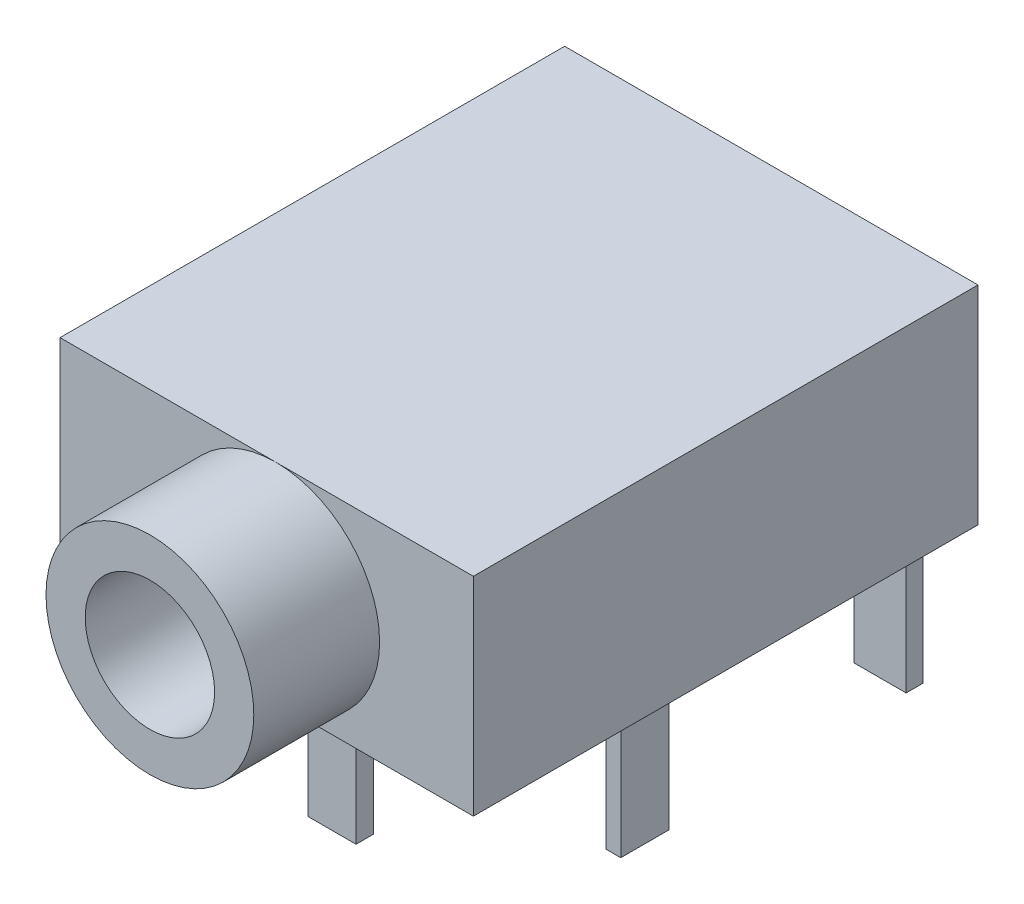
ISO-10303-21;
HEADER;
FILE_DESCRIPTION(('STEP AP214'),'2;1');
FILE_NAME('part.step','',(''),(''),'','','');
FILE_SCHEMA(('AUTOMOTIVE_DESIGN { 1 0 10303 214 1 1 1 1 }'));
ENDSEC;
DATA;
#1=APPLICATION_CONTEXT('core data for automotive mechanical design processes');
#2=APPLICATION_PROTOCOL_DEFINITION('international standard','automotive_design',2000,#1);
#3=PRODUCT_CONTEXT('',#1,'mechanical');
#4=PRODUCT('Part','Part','',(#3));
#5=PRODUCT_RELATED_PRODUCT_CATEGORY('part','',(#4));
#6=PRODUCT_DEFINITION_FORMATION('','',#4);
#7=PRODUCT_DEFINITION_CONTEXT('part definition',#1,'design');
#8=PRODUCT_DEFINITION('design','',#6,#7);
#9=PRODUCT_DEFINITION_SHAPE('','',#8);
#10=(LENGTH_UNIT() NAMED_UNIT(*) SI_UNIT(.MILLI.,.METRE.));
#11=(NAMED_UNIT(*) PLANE_ANGLE_UNIT() SI_UNIT($,.RADIAN.));
#12=(NAMED_UNIT(*) SI_UNIT($,.STERADIAN.) SOLID_ANGLE_UNIT());
#13=UNCERTAINTY_MEASURE_WITH_UNIT(LENGTH_MEASURE(1.E-05),#10,'distance_accuracy_value','');
#14=(GEOMETRIC_REPRESENTATION_CONTEXT(3) GLOBAL_UNCERTAINTY_ASSIGNED_CONTEXT((#13)) GLOBAL_UNIT_ASSIGNED_CONTEXT((#10,
#11,#12)) REPRESENTATION_CONTEXT('',''));
#15=CARTESIAN_POINT('',(0.,0.,0.));
#16=DIRECTION('',(0.,0.,1.));
#17=DIRECTION('',(1.,0.,0.));
#18=AXIS2_PLACEMENT_3D('',#15,#16,#17);
#19=CARTESIAN_POINT('',(5.75,-0.00598738400779501,-0.0115893273797702));
#20=DIRECTION('',(0.,1.,0.));
#21=DIRECTION('',(0.,0.,1.));
#22=AXIS2_PLACEMENT_3D('',#19,#20,#21);
#23=PLANE('',#22);
#24=DIRECTION('',(-1.,0.,0.));
#25=VECTOR('',#24,1.);
#26=CARTESIAN_POINT('',(4.80049461253483,-0.00598738400779501,-5.06124471957516));
#27=LINE('',#26,#25);
#28=CARTESIAN_POINT('',(4.80049461253483,-0.00598738400779501,-5.06124471957516));
#29=VERTEX_POINT('',#28);
#30=CARTESIAN_POINT('',(4.38361750312257,-0.00598738400779501,-5.06124471957516));
#31=VERTEX_POINT('',#30);
#32=EDGE_CURVE('E225',#29,#31,#27,.T.);
#33=ORIENTED_EDGE('',*,*,#32,.F.);
#34=DIRECTION('',(0.,0.,1.));
#35=VECTOR('',#34,1.);
#36=CARTESIAN_POINT('',(4.80049461253483,-0.00598738400779501,-5.06124471957516));
#37=LINE('',#36,#35);
#38=CARTESIAN_POINT('',(4.80049461253483,-0.00598738400779501,-6.40451540545913));
#39=VERTEX_POINT('',#38);
#40=EDGE_CURVE('E238',#39,#29,#37,.T.);
#41=ORIENTED_EDGE('',*,*,#40,.F.);
#42=DIRECTION('',(1.,0.,0.));
#43=VECTOR('',#42,1.);
#44=CARTESIAN_POINT('',(4.80049461253483,-0.00598738400779501,-6.40451540545913));
#45=LINE('',#44,#43);
#46=CARTESIAN_POINT('',(4.38361750312257,-0.00598738400779501,-6.40451540545913));
#47=VERTEX_POINT('',#46);
#48=EDGE_CURVE('E247',#47,#39,#45,.T.);
#49=ORIENTED_EDGE('',*,*,#48,.F.);
#50=DIRECTION('',(0.,0.,-1.));
#51=VECTOR('',#50,1.);
#52=CARTESIAN_POINT('',(4.38361750312257,-0.00598738400779501,-5.06124471957516));
#53=LINE('',#52,#51);
#54=EDGE_CURVE('E228',#31,#47,#53,.T.);
#55=ORIENTED_EDGE('',*,*,#54,.F.);
#56=EDGE_LOOP('',(#33,#41,#49,#55));
#57=FACE_BOUND('',#56,.T.);
#58=DIRECTION('',(-1.,0.,0.));
#59=VECTOR('',#58,1.);
#60=CARTESIAN_POINT('',(-4.62556002806475,-0.00598738400779501,-9.2994953319332));
#61=LINE('',#60,#59);
#62=CARTESIAN_POINT('',(-4.62556002806475,-0.00598738400779501,-9.2994953319332));
#63=VERTEX_POINT('',#62);
#64=CARTESIAN_POINT('',(-5.06559697688881,-0.00598738400779501,-9.2994953319332));
#65=VERTEX_POINT('',#64);
#66=EDGE_CURVE('E296',#63,#65,#61,.T.);
#67=ORIENTED_EDGE('',*,*,#66,.F.);
#68=DIRECTION('',(0.,0.,1.));
#69=VECTOR('',#68,1.);
#70=CARTESIAN_POINT('',(-4.62556002806475,-0.00598738400779501,-9.2994953319332));
#71=LINE('',#70,#69);
#72=CARTESIAN_POINT('',(-4.62556002806475,-0.00598738400779501,-10.7122455360525));
#73=VERTEX_POINT('',#72);
#74=EDGE_CURVE('E301',#73,#63,#71,.T.);
#75=ORIENTED_EDGE('',*,*,#74,.F.);
#76=DIRECTION('',(1.,0.,0.));
#77=VECTOR('',#76,1.);
#78=CARTESIAN_POINT('',(-4.62556002806475,-0.00598738400779501,-10.7122455360525));
#79=LINE('',#78,#77);
#80=CARTESIAN_POINT('',(-5.06559697688881,-0.00598738400779501,-10.7122455360525));
#81=VERTEX_POINT('',#80);
#82=EDGE_CURVE('E313',#81,#73,#79,.T.);
#83=ORIENTED_EDGE('',*,*,#82,.F.);
#84=DIRECTION('',(0.,0.,-1.));
#85=VECTOR('',#84,1.);
#86=CARTESIAN_POINT('',(-5.06559697688881,-0.00598738400779501,-9.2994953319332));
#87=LINE('',#86,#85);
#88=EDGE_CURVE('E310',#65,#81,#87,.T.);
#89=ORIENTED_EDGE('',*,*,#88,.F.);
#90=EDGE_LOOP('',(#67,#75,#83,#89));
#91=FACE_BOUND('',#90,.T.);
#92=DIRECTION('',(0.,0.,-1.));
#93=VECTOR('',#92,1.);
#94=CARTESIAN_POINT('',(-5.75,-0.00598738400779501,-0.0115893273797702));
#95=LINE('',#94,#93);
#96=CARTESIAN_POINT('',(-5.75,-0.00598738400779501,-0.0115893273797702));
#97=VERTEX_POINT('',#96);
#98=CARTESIAN_POINT('',(-5.75,-0.00598738400779501,-14.0506281407972));
#99=VERTEX_POINT('',#98);
#100=EDGE_CURVE('E389',#97,#99,#95,.T.);
#101=ORIENTED_EDGE('',*,*,#100,.T.);
#102=DIRECTION('',(-1.,0.,0.));
#103=VECTOR('',#102,1.);
#104=CARTESIAN_POINT('',(5.75,-0.00598738400779501,-14.0506281407972));
#105=LINE('',#104,#103);
#106=CARTESIAN_POINT('',(5.75,-0.00598738400779501,-14.0506281407972));
#107=VERTEX_POINT('',#106);
#108=EDGE_CURVE('E394',#107,#99,#105,.T.);
#109=ORIENTED_EDGE('',*,*,#108,.F.);
#110=DIRECTION('',(0.,0.,-1.));
#111=VECTOR('',#110,1.);
#112=CARTESIAN_POINT('',(5.75,-0.00598738400779501,-0.0115893273797702));
#113=LINE('',#112,#111);
#114=CARTESIAN_POINT('',(5.75,-0.00598738400779501,-0.0115893273797702));
#115=VERTEX_POINT('',#114);
#116=EDGE_CURVE('E379',#115,#107,#113,.T.);
#117=ORIENTED_EDGE('',*,*,#116,.F.);
#118=DIRECTION('',(-1.,0.,0.));
#119=VECTOR('',#118,1.);
#120=CARTESIAN_POINT('',(5.75,-0.00598738400779501,-0.0115893273797702));
#121=LINE('',#120,#119);
#122=CARTESIAN_POINT('',(0.25,-0.00598738400779501,-0.0115893273797702));
#123=VERTEX_POINT('',#122);
#124=EDGE_CURVE('E397',#115,#123,#121,.T.);
#125=ORIENTED_EDGE('',*,*,#124,.T.);
#126=EDGE_CURVE('E396',#123,#97,#121,.T.);
#127=ORIENTED_EDGE('',*,*,#126,.T.);
#128=EDGE_LOOP('',(#101,#109,#117,#125,#127));
#129=FACE_BOUND('',#128,.T.);
#130=DIRECTION('',(0.,0.,1.));
#131=VECTOR('',#130,1.);
#132=CARTESIAN_POINT('',(4.80049461253483,-0.00598738400779501,-13.0001475178515));
#133=LINE('',#132,#131);
#134=CARTESIAN_POINT('',(4.80049461253483,-0.00598738400779501,-13.4692953083365));
#135=VERTEX_POINT('',#134);
#136=CARTESIAN_POINT('',(4.80049461253483,-0.00598738400779501,-13.0001475178515));
#137=VERTEX_POINT('',#136);
#138=EDGE_CURVE('E329',#135,#137,#133,.T.);
#139=ORIENTED_EDGE('',*,*,#138,.F.);
#140=DIRECTION('',(1.,0.,0.));
#141=VECTOR('',#140,1.);
#142=CARTESIAN_POINT('',(4.80049461253483,-0.00598738400779501,-13.4692953083365));
#143=LINE('',#142,#141);
#144=CARTESIAN_POINT('',(3.35494919130028,-0.00598738400779501,-13.4692953083365));
#145=VERTEX_POINT('',#144);
#146=EDGE_CURVE('E334',#145,#135,#143,.T.);
#147=ORIENTED_EDGE('',*,*,#146,.F.);
#148=DIRECTION('',(0.,0.,-1.));
#149=VECTOR('',#148,1.);
#150=CARTESIAN_POINT('',(3.35494919130028,-0.00598738400779501,-13.0001475178515));
#151=LINE('',#150,#149);
#152=CARTESIAN_POINT('',(3.35494919130028,-0.00598738400779501,-13.0001475178515));
#153=VERTEX_POINT('',#152);
#154=EDGE_CURVE('E346',#153,#145,#151,.T.);
#155=ORIENTED_EDGE('',*,*,#154,.F.);
#156=DIRECTION('',(-1.,0.,0.));
#157=VECTOR('',#156,1.);
#158=CARTESIAN_POINT('',(4.80049461253483,-0.00598738400779501,-13.0001475178515));
#159=LINE('',#158,#157);
#160=EDGE_CURVE('E343',#137,#153,#159,.T.);
#161=ORIENTED_EDGE('',*,*,#160,.F.);
#162=EDGE_LOOP('',(#139,#147,#155,#161));
#163=FACE_BOUND('',#162,.T.);
#164=DIRECTION('',(-1.,0.,0.));
#165=VECTOR('',#164,1.);
#166=CARTESIAN_POINT('',(-2.17061705041474,-0.00598738400779501,-8.0257041642846));
#167=LINE('',#166,#165);
#168=CARTESIAN_POINT('',(-2.17061705041474,-0.00598738400779501,-8.0257041642846));
#169=VERTEX_POINT('',#168);
#170=CARTESIAN_POINT('',(-2.63381383865059,-0.00598738400779501,-8.0257041642846));
#171=VERTEX_POINT('',#170);
#172=EDGE_CURVE('E263',#169,#171,#167,.T.);
#173=ORIENTED_EDGE('',*,*,#172,.F.);
#174=DIRECTION('',(0.,0.,1.));
#175=VECTOR('',#174,1.);
#176=CARTESIAN_POINT('',(-2.17061705041474,-0.00598738400779501,-8.0257041642846));
#177=LINE('',#176,#175);
#178=CARTESIAN_POINT('',(-2.17061705041474,-0.00598738400779501,-9.46161420781575));
#179=VERTEX_POINT('',#178);
#180=EDGE_CURVE('E268',#179,#169,#177,.T.);
#181=ORIENTED_EDGE('',*,*,#180,.F.);
#182=DIRECTION('',(1.,0.,0.));
#183=VECTOR('',#182,1.);
#184=CARTESIAN_POINT('',(-2.17061705041474,-0.00598738400779501,-9.46161420781575));
#185=LINE('',#184,#183);
#186=CARTESIAN_POINT('',(-2.63381383865059,-0.00598738400779501,-9.46161420781575));
#187=VERTEX_POINT('',#186);
#188=EDGE_CURVE('E280',#187,#179,#185,.T.);
#189=ORIENTED_EDGE('',*,*,#188,.F.);
#190=DIRECTION('',(0.,0.,-1.));
#191=VECTOR('',#190,1.);
#192=CARTESIAN_POINT('',(-2.63381383865059,-0.00598738400779501,-8.0257041642846));
#193=LINE('',#192,#191);
#194=EDGE_CURVE('E277',#171,#187,#193,.T.);
#195=ORIENTED_EDGE('',*,*,#194,.F.);
#196=EDGE_LOOP('',(#173,#181,#189,#195));
#197=FACE_BOUND('',#196,.T.);
#198=DIRECTION('',(-1.,0.,0.));
#199=VECTOR('',#198,1.);
#200=CARTESIAN_POINT('',(0.793842394294714,-0.00598738400779501,-1.70306800486523));
#201=LINE('',#200,#199);
#202=CARTESIAN_POINT('',(0.793842394294714,-0.00598738400779501,-1.70306800486523));
#203=VERTEX_POINT('',#202);
#204=CARTESIAN_POINT('',(-0.549428291589254,-0.00598738400779501,-1.70306800486523));
#205=VERTEX_POINT('',#204);
#206=EDGE_CURVE('E224',#203,#205,#201,.T.);
#207=ORIENTED_EDGE('',*,*,#206,.F.);
#208=DIRECTION('',(0.,0.,1.));
#209=VECTOR('',#208,1.);
#210=CARTESIAN_POINT('',(0.793842394294714,-0.00598738400779501,-1.70306800486523));
#211=LINE('',#210,#209);
#212=CARTESIAN_POINT('',(0.793842394294714,-0.00598738400779501,-2.18942463251288));
#213=VERTEX_POINT('',#212);
#214=EDGE_CURVE('E221',#213,#203,#211,.T.);
#215=ORIENTED_EDGE('',*,*,#214,.F.);
#216=DIRECTION('',(1.,0.,0.));
#217=VECTOR('',#216,1.);
#218=CARTESIAN_POINT('',(0.793842394294714,-0.00598738400779501,-2.18942463251288));
#219=LINE('',#218,#217);
#220=CARTESIAN_POINT('',(-0.549428291589254,-0.00598738400779501,-2.18942463251288));
#221=VERTEX_POINT('',#220);
#222=EDGE_CURVE('E57',#221,#213,#219,.T.);
#223=ORIENTED_EDGE('',*,*,#222,.F.);
#224=DIRECTION('',(0.,0.,-1.));
#225=VECTOR('',#224,1.);
#226=CARTESIAN_POINT('',(-0.549428291589254,-0.00598738400779501,-1.70306800486523));
#227=LINE('',#226,#225);
#228=EDGE_CURVE('E52',#205,#221,#227,.T.);
#229=ORIENTED_EDGE('',*,*,#228,.F.);
#230=EDGE_LOOP('',(#207,#215,#223,#229));
#231=FACE_BOUND('',#230,.T.);
#232=ADVANCED_FACE('F35',(#57,#91,#129,#163,#197,#231),#23,.F.);
#233=CARTESIAN_POINT('',(5.75,5.77511223671404,-0.0115893273797702));
#234=DIRECTION('',(0.,0.,-1.));
#235=DIRECTION('',(-1.,0.,0.));
#236=AXIS2_PLACEMENT_3D('',#233,#234,#235);
#237=PLANE('',#236);
#238=CARTESIAN_POINT('',(0.25,2.88456242635312,-0.0115893273797702));
#239=DIRECTION('',(0.,0.,1.));
#240=DIRECTION('',(1.,0.,0.));
#241=AXIS2_PLACEMENT_3D('',#238,#239,#240);
#242=CIRCLE('',#241,2.89054981036091);
#243=CARTESIAN_POINT('',(0.25,5.77511223671403,-0.0115893273797702));
#244=VERTEX_POINT('',#243);
#245=EDGE_CURVE('E45',#244,#123,#242,.T.);
#246=ORIENTED_EDGE('',*,*,#245,.F.);
#247=DIRECTION('',(-1.,0.,0.));
#248=VECTOR('',#247,1.);
#249=CARTESIAN_POINT('',(5.75,5.77511223671404,-0.0115893273797702));
#250=LINE('',#249,#248);
#251=CARTESIAN_POINT('',(-5.75,5.77511223671404,-0.0115893273797702));
#252=VERTEX_POINT('',#251);
#253=EDGE_CURVE('E399',#244,#252,#250,.T.);
#254=ORIENTED_EDGE('',*,*,#253,.T.);
#255=DIRECTION('',(0.,-1.,0.));
#256=VECTOR('',#255,1.);
#257=CARTESIAN_POINT('',(-5.75,5.77511223671404,-0.0115893273797702));
#258=LINE('',#257,#256);
#259=EDGE_CURVE('E386',#252,#97,#258,.T.);
#260=ORIENTED_EDGE('',*,*,#259,.T.);
#261=ORIENTED_EDGE('',*,*,#126,.F.);
#262=EDGE_LOOP('',(#246,#254,#260,#261));
#263=FACE_BOUND('',#262,.T.);
#264=ADVANCED_FACE('F410',(#263),#237,.F.);
#265=CARTESIAN_POINT('',(5.75,5.77511223671404,-14.0506281407972));
#266=DIRECTION('',(0.,-1.,0.));
#267=DIRECTION('',(0.,0.,-1.));
#268=AXIS2_PLACEMENT_3D('',#265,#266,#267);
#269=PLANE('',#268);
#270=DIRECTION('',(0.,0.,1.));
#271=VECTOR('',#270,1.);
#272=CARTESIAN_POINT('',(-5.75,5.77511223671404,-14.0506281407972));
#273=LINE('',#272,#271);
#274=CARTESIAN_POINT('',(-5.75,5.77511223671404,-14.0506281407972));
#275=VERTEX_POINT('',#274);
#276=EDGE_CURVE('E370',#275,#252,#273,.T.);
#277=ORIENTED_EDGE('',*,*,#276,.T.);
#278=ORIENTED_EDGE('',*,*,#253,.F.);
#279=CARTESIAN_POINT('',(5.75,5.77511223671404,-0.0115893273797702));
#280=VERTEX_POINT('',#279);
#281=EDGE_CURVE('E39',#280,#244,#250,.T.);
#282=ORIENTED_EDGE('',*,*,#281,.F.);
#283=DIRECTION('',(0.,0.,1.));
#284=VECTOR('',#283,1.);
#285=CARTESIAN_POINT('',(5.75,5.77511223671404,-14.0506281407972));
#286=LINE('',#285,#284);
#287=CARTESIAN_POINT('',(5.75,5.77511223671404,-14.0506281407972));
#288=VERTEX_POINT('',#287);
#289=EDGE_CURVE('E373',#288,#280,#286,.T.);
#290=ORIENTED_EDGE('',*,*,#289,.F.);
#291=DIRECTION('',(-1.,0.,0.));
#292=VECTOR('',#291,1.);
#293=CARTESIAN_POINT('',(5.75,5.77511223671404,-14.0506281407972));
#294=LINE('',#293,#292);
#295=EDGE_CURVE('E383',#288,#275,#294,.T.);
#296=ORIENTED_EDGE('',*,*,#295,.T.);
#297=EDGE_LOOP('',(#277,#278,#282,#290,#296));
#298=FACE_BOUND('',#297,.T.);
#299=ADVANCED_FACE('F37',(#298),#269,.F.);
#300=EDGE_CURVE('E11',#123,#244,#242,.T.);
#301=ORIENTED_EDGE('',*,*,#300,.F.);
#302=ORIENTED_EDGE('',*,*,#124,.F.);
#303=DIRECTION('',(0.,-1.,0.));
#304=VECTOR('',#303,1.);
#305=CARTESIAN_POINT('',(5.75,5.77511223671404,-0.0115893273797702));
#306=LINE('',#305,#304);
#307=EDGE_CURVE('E376',#280,#115,#306,.T.);
#308=ORIENTED_EDGE('',*,*,#307,.F.);
#309=ORIENTED_EDGE('',*,*,#281,.T.);
#310=EDGE_LOOP('',(#301,#302,#308,#309));
#311=FACE_BOUND('',#310,.T.);
#312=ADVANCED_FACE('F426',(#311),#237,.F.);
#313=CARTESIAN_POINT('',(5.75,-0.00598738400779501,-14.0506281407972));
#314=DIRECTION('',(0.,0.,1.));
#315=DIRECTION('',(1.,0.,0.));
#316=AXIS2_PLACEMENT_3D('',#313,#314,#315);
#317=PLANE('',#316);
#318=DIRECTION('',(0.,1.,0.));
#319=VECTOR('',#318,1.);
#320=CARTESIAN_POINT('',(-5.75,-0.00598738400779501,-14.0506281407972));
#321=LINE('',#320,#319);
#322=EDGE_CURVE('E377',#99,#275,#321,.T.);
#323=ORIENTED_EDGE('',*,*,#322,.T.);
#324=ORIENTED_EDGE('',*,*,#295,.F.);
#325=DIRECTION('',(0.,1.,0.));
#326=VECTOR('',#325,1.);
#327=CARTESIAN_POINT('',(5.75,-0.00598738400779501,-14.0506281407972));
#328=LINE('',#327,#326);
#329=EDGE_CURVE('E381',#107,#288,#328,.T.);
#330=ORIENTED_EDGE('',*,*,#329,.F.);
#331=ORIENTED_EDGE('',*,*,#108,.T.);
#332=EDGE_LOOP('',(#323,#324,#330,#331));
#333=FACE_BOUND('',#332,.T.);
#334=ADVANCED_FACE('F418',(#333),#317,.F.);
#335=CARTESIAN_POINT('',(5.75,0.,0.));
#336=DIRECTION('',(1.,0.,0.));
#337=DIRECTION('',(0.,0.,-1.));
#338=AXIS2_PLACEMENT_3D('',#335,#336,#337);
#339=PLANE('',#338);
#340=ORIENTED_EDGE('',*,*,#289,.T.);
#341=ORIENTED_EDGE('',*,*,#307,.T.);
#342=ORIENTED_EDGE('',*,*,#116,.T.);
#343=ORIENTED_EDGE('',*,*,#329,.T.);
#344=EDGE_LOOP('',(#340,#341,#342,#343));
#345=FACE_BOUND('',#344,.T.);
#346=ADVANCED_FACE('F424',(#345),#339,.T.);
#347=CARTESIAN_POINT('',(-5.75,0.,0.));
#348=DIRECTION('',(1.,0.,0.));
#349=DIRECTION('',(0.,0.,-1.));
#350=AXIS2_PLACEMENT_3D('',#347,#348,#349);
#351=PLANE('',#350);
#352=ORIENTED_EDGE('',*,*,#276,.F.);
#353=ORIENTED_EDGE('',*,*,#322,.F.);
#354=ORIENTED_EDGE('',*,*,#100,.F.);
#355=ORIENTED_EDGE('',*,*,#259,.F.);
#356=EDGE_LOOP('',(#352,#353,#354,#355));
#357=FACE_BOUND('',#356,.T.);
#358=ADVANCED_FACE('F415',(#357),#351,.F.);
#359=CARTESIAN_POINT('',(0.25,2.88456242635312,3.48841067262023));
#360=DIRECTION('',(0.,0.,1.));
#361=DIRECTION('',(1.,0.,0.));
#362=AXIS2_PLACEMENT_3D('',#359,#360,#361);
#363=PLANE('',#362);
#364=CARTESIAN_POINT('',(0.25,2.88456242635312,3.48841067262023));
#365=DIRECTION('',(0.,0.,1.));
#366=DIRECTION('',(1.,0.,0.));
#367=AXIS2_PLACEMENT_3D('',#364,#365,#366);
#368=CIRCLE('',#367,2.89054981036091);
#369=CARTESIAN_POINT('',(3.14054981036091,2.88456242635312,3.48841067262023));
#370=VERTEX_POINT('',#369);
#371=EDGE_CURVE('E368',#370,#370,#368,.T.);
#372=ORIENTED_EDGE('',*,*,#371,.T.);
#373=EDGE_LOOP('',(#372));
#374=FACE_BOUND('',#373,.T.);
#375=CARTESIAN_POINT('',(0.25,2.88456242635312,3.48841067262023));
#376=DIRECTION('',(0.,0.,1.));
#377=DIRECTION('',(1.,0.,0.));
#378=AXIS2_PLACEMENT_3D('',#375,#376,#377);
#379=CIRCLE('',#378,1.8);
#380=CARTESIAN_POINT('',(2.05,2.88456242635312,3.48841067262023));
#381=VERTEX_POINT('',#380);
#382=EDGE_CURVE('E363',#381,#381,#379,.T.);
#383=ORIENTED_EDGE('',*,*,#382,.F.);
#384=EDGE_LOOP('',(#383));
#385=FACE_BOUND('',#384,.T.);
#386=ADVANCED_FACE('F431',(#374,#385),#363,.T.);
#387=CARTESIAN_POINT('',(0.25,2.88456242635312,3.48841067262023));
#388=DIRECTION('',(0.,0.,-1.));
#389=DIRECTION('',(-1.,0.,0.));
#390=AXIS2_PLACEMENT_3D('',#387,#388,#389);
#391=CYLINDRICAL_SURFACE('',#390,2.89054981036091);
#392=ORIENTED_EDGE('',*,*,#371,.F.);
#393=EDGE_LOOP('',(#392));
#394=FACE_BOUND('',#393,.T.);
#395=ORIENTED_EDGE('',*,*,#245,.T.);
#396=ORIENTED_EDGE('',*,*,#300,.T.);
#397=EDGE_LOOP('',(#395,#396));
#398=FACE_BOUND('',#397,.T.);
#399=ADVANCED_FACE('F428',(#394,#398),#391,.T.);
#400=CARTESIAN_POINT('',(0.25,2.88456242635312,3.48841067262023));
#401=DIRECTION('',(0.,0.,-1.));
#402=DIRECTION('',(-1.,0.,0.));
#403=AXIS2_PLACEMENT_3D('',#400,#401,#402);
#404=CYLINDRICAL_SURFACE('',#403,1.8);
#405=ORIENTED_EDGE('',*,*,#382,.T.);
#406=EDGE_LOOP('',(#405));
#407=FACE_BOUND('',#406,.T.);
#408=CARTESIAN_POINT('',(0.25,2.88456242635312,-0.0115893273797702));
#409=DIRECTION('',(0.,0.,1.));
#410=DIRECTION('',(1.,0.,0.));
#411=AXIS2_PLACEMENT_3D('',#408,#409,#410);
#412=CIRCLE('',#411,1.8);
#413=CARTESIAN_POINT('',(2.05,2.88456242635312,-0.0115893273797702));
#414=VERTEX_POINT('',#413);
#415=EDGE_CURVE('E362',#414,#414,#412,.T.);
#416=ORIENTED_EDGE('',*,*,#415,.F.);
#417=EDGE_LOOP('',(#416));
#418=FACE_BOUND('',#417,.T.);
#419=ADVANCED_FACE('F430',(#407,#418),#404,.F.);
#420=ORIENTED_EDGE('',*,*,#415,.T.);
#421=EDGE_LOOP('',(#420));
#422=FACE_BOUND('',#421,.T.);
#423=ADVANCED_FACE('F438',(#422),#237,.F.);
#424=CARTESIAN_POINT('',(4.80049461253483,-4.0059873840078,-13.0001475178515));
#425=DIRECTION('',(-1.,0.,0.));
#426=DIRECTION('',(0.,0.,1.));
#427=AXIS2_PLACEMENT_3D('',#424,#425,#426);
#428=PLANE('',#427);
#429=ORIENTED_EDGE('',*,*,#138,.T.);
#430=DIRECTION('',(0.,1.,0.));
#431=VECTOR('',#430,1.);
#432=CARTESIAN_POINT('',(4.80049461253483,-4.0059873840078,-13.0001475178515));
#433=LINE('',#432,#431);
#434=CARTESIAN_POINT('',(4.80049461253483,-4.0059873840078,-13.0001475178515));
#435=VERTEX_POINT('',#434);
#436=EDGE_CURVE('E359',#435,#137,#433,.T.);
#437=ORIENTED_EDGE('',*,*,#436,.F.);
#438=DIRECTION('',(0.,0.,1.));
#439=VECTOR('',#438,1.);
#440=CARTESIAN_POINT('',(4.80049461253483,-4.0059873840078,-13.0001475178515));
#441=LINE('',#440,#439);
#442=CARTESIAN_POINT('',(4.80049461253483,-4.0059873840078,-13.4692953083365));
#443=VERTEX_POINT('',#442);
#444=EDGE_CURVE('E330',#443,#435,#441,.T.);
#445=ORIENTED_EDGE('',*,*,#444,.F.);
#446=DIRECTION('',(0.,1.,0.));
#447=VECTOR('',#446,1.);
#448=CARTESIAN_POINT('',(4.80049461253483,-4.0059873840078,-13.4692953083365));
#449=LINE('',#448,#447);
#450=EDGE_CURVE('E340',#443,#135,#449,.T.);
#451=ORIENTED_EDGE('',*,*,#450,.T.);
#452=EDGE_LOOP('',(#429,#437,#445,#451));
#453=FACE_BOUND('',#452,.T.);
#454=ADVANCED_FACE('F460',(#453),#428,.F.);
#455=CARTESIAN_POINT('',(4.80049461253483,-4.0059873840078,-13.0001475178515));
#456=DIRECTION('',(0.,0.,-1.));
#457=DIRECTION('',(-1.,0.,0.));
#458=AXIS2_PLACEMENT_3D('',#455,#456,#457);
#459=PLANE('',#458);
#460=ORIENTED_EDGE('',*,*,#160,.T.);
#461=DIRECTION('',(0.,1.,0.));
#462=VECTOR('',#461,1.);
#463=CARTESIAN_POINT('',(3.35494919130028,-4.0059873840078,-13.0001475178515));
#464=LINE('',#463,#462);
#465=CARTESIAN_POINT('',(3.35494919130028,-4.0059873840078,-13.0001475178515));
#466=VERTEX_POINT('',#465);
#467=EDGE_CURVE('E356',#466,#153,#464,.T.);
#468=ORIENTED_EDGE('',*,*,#467,.F.);
#469=DIRECTION('',(-1.,0.,0.));
#470=VECTOR('',#469,1.);
#471=CARTESIAN_POINT('',(4.80049461253483,-4.0059873840078,-13.0001475178515));
#472=LINE('',#471,#470);
#473=EDGE_CURVE('E333',#435,#466,#472,.T.);
#474=ORIENTED_EDGE('',*,*,#473,.F.);
#475=ORIENTED_EDGE('',*,*,#436,.T.);
#476=EDGE_LOOP('',(#460,#468,#474,#475));
#477=FACE_BOUND('',#476,.T.);
#478=ADVANCED_FACE('F465',(#477),#459,.F.);
#479=CARTESIAN_POINT('',(3.35494919130028,-4.0059873840078,-13.0001475178515));
#480=DIRECTION('',(1.,0.,0.));
#481=DIRECTION('',(0.,0.,-1.));
#482=AXIS2_PLACEMENT_3D('',#479,#480,#481);
#483=PLANE('',#482);
#484=ORIENTED_EDGE('',*,*,#154,.T.);
#485=DIRECTION('',(0.,1.,0.));
#486=VECTOR('',#485,1.);
#487=CARTESIAN_POINT('',(3.35494919130028,-4.0059873840078,-13.4692953083365));
#488=LINE('',#487,#486);
#489=CARTESIAN_POINT('',(3.35494919130028,-4.0059873840078,-13.4692953083365));
#490=VERTEX_POINT('',#489);
#491=EDGE_CURVE('E353',#490,#145,#488,.T.);
#492=ORIENTED_EDGE('',*,*,#491,.F.);
#493=DIRECTION('',(0.,0.,-1.));
#494=VECTOR('',#493,1.);
#495=CARTESIAN_POINT('',(3.35494919130028,-4.0059873840078,-13.0001475178515));
#496=LINE('',#495,#494);
#497=EDGE_CURVE('E336',#466,#490,#496,.T.);
#498=ORIENTED_EDGE('',*,*,#497,.F.);
#499=ORIENTED_EDGE('',*,*,#467,.T.);
#500=EDGE_LOOP('',(#484,#492,#498,#499));
#501=FACE_BOUND('',#500,.T.);
#502=ADVANCED_FACE('F473',(#501),#483,.F.);
#503=CARTESIAN_POINT('',(4.80049461253483,-4.0059873840078,-13.4692953083365));
#504=DIRECTION('',(0.,0.,1.));
#505=DIRECTION('',(1.,0.,0.));
#506=AXIS2_PLACEMENT_3D('',#503,#504,#505);
#507=PLANE('',#506);
#508=ORIENTED_EDGE('',*,*,#146,.T.);
#509=ORIENTED_EDGE('',*,*,#450,.F.);
#510=DIRECTION('',(1.,0.,0.));
#511=VECTOR('',#510,1.);
#512=CARTESIAN_POINT('',(4.80049461253483,-4.0059873840078,-13.4692953083365));
#513=LINE('',#512,#511);
#514=EDGE_CURVE('E338',#490,#443,#513,.T.);
#515=ORIENTED_EDGE('',*,*,#514,.F.);
#516=ORIENTED_EDGE('',*,*,#491,.T.);
#517=EDGE_LOOP('',(#508,#509,#515,#516));
#518=FACE_BOUND('',#517,.T.);
#519=ADVANCED_FACE('F479',(#518),#507,.F.);
#520=CARTESIAN_POINT('',(0.,-4.0059873840078,0.));
#521=DIRECTION('',(0.,1.,0.));
#522=DIRECTION('',(0.,0.,1.));
#523=AXIS2_PLACEMENT_3D('',#520,#521,#522);
#524=PLANE('',#523);
#525=ORIENTED_EDGE('',*,*,#444,.T.);
#526=ORIENTED_EDGE('',*,*,#473,.T.);
#527=ORIENTED_EDGE('',*,*,#497,.T.);
#528=ORIENTED_EDGE('',*,*,#514,.T.);
#529=EDGE_LOOP('',(#525,#526,#527,#528));
#530=FACE_BOUND('',#529,.T.);
#531=ADVANCED_FACE('F483',(#530),#524,.F.);
#532=CARTESIAN_POINT('',(-4.62556002806475,-4.0059873840078,-9.2994953319332));
#533=DIRECTION('',(0.,0.,-1.));
#534=DIRECTION('',(-1.,0.,0.));
#535=AXIS2_PLACEMENT_3D('',#532,#533,#534);
#536=PLANE('',#535);
#537=ORIENTED_EDGE('',*,*,#66,.T.);
#538=DIRECTION('',(0.,1.,0.));
#539=VECTOR('',#538,1.);
#540=CARTESIAN_POINT('',(-5.06559697688881,-4.0059873840078,-9.2994953319332));
#541=LINE('',#540,#539);
#542=CARTESIAN_POINT('',(-5.06559697688881,-4.0059873840078,-9.2994953319332));
#543=VERTEX_POINT('',#542);
#544=EDGE_CURVE('E326',#543,#65,#541,.T.);
#545=ORIENTED_EDGE('',*,*,#544,.F.);
#546=DIRECTION('',(-1.,0.,0.));
#547=VECTOR('',#546,1.);
#548=CARTESIAN_POINT('',(-4.62556002806475,-4.0059873840078,-9.2994953319332));
#549=LINE('',#548,#547);
#550=CARTESIAN_POINT('',(-4.62556002806475,-4.0059873840078,-9.2994953319332));
#551=VERTEX_POINT('',#550);
#552=EDGE_CURVE('E297',#551,#543,#549,.T.);
#553=ORIENTED_EDGE('',*,*,#552,.F.);
#554=DIRECTION('',(0.,1.,0.));
#555=VECTOR('',#554,1.);
#556=CARTESIAN_POINT('',(-4.62556002806475,-4.0059873840078,-9.2994953319332));
#557=LINE('',#556,#555);
#558=EDGE_CURVE('E307',#551,#63,#557,.T.);
#559=ORIENTED_EDGE('',*,*,#558,.T.);
#560=EDGE_LOOP('',(#537,#545,#553,#559));
#561=FACE_BOUND('',#560,.T.);
#562=ADVANCED_FACE('F487',(#561),#536,.F.);
#563=CARTESIAN_POINT('',(-5.06559697688881,-4.0059873840078,-9.2994953319332));
#564=DIRECTION('',(1.,0.,0.));
#565=DIRECTION('',(0.,0.,-1.));
#566=AXIS2_PLACEMENT_3D('',#563,#564,#565);
#567=PLANE('',#566);
#568=ORIENTED_EDGE('',*,*,#88,.T.);
#569=DIRECTION('',(0.,1.,0.));
#570=VECTOR('',#569,1.);
#571=CARTESIAN_POINT('',(-5.06559697688881,-4.0059873840078,-10.7122455360525));
#572=LINE('',#571,#570);
#573=CARTESIAN_POINT('',(-5.06559697688881,-4.0059873840078,-10.7122455360525));
#574=VERTEX_POINT('',#573);
#575=EDGE_CURVE('E323',#574,#81,#572,.T.);
#576=ORIENTED_EDGE('',*,*,#575,.F.);
#577=DIRECTION('',(0.,0.,-1.));
#578=VECTOR('',#577,1.);
#579=CARTESIAN_POINT('',(-5.06559697688881,-4.0059873840078,-9.2994953319332));
#580=LINE('',#579,#578);
#581=EDGE_CURVE('E300',#543,#574,#580,.T.);
#582=ORIENTED_EDGE('',*,*,#581,.F.);
#583=ORIENTED_EDGE('',*,*,#544,.T.);
#584=EDGE_LOOP('',(#568,#576,#582,#583));
#585=FACE_BOUND('',#584,.T.);
#586=ADVANCED_FACE('F491',(#585),#567,.F.);
#587=CARTESIAN_POINT('',(-4.62556002806475,-4.0059873840078,-10.7122455360525));
#588=DIRECTION('',(0.,0.,1.));
#589=DIRECTION('',(1.,0.,0.));
#590=AXIS2_PLACEMENT_3D('',#587,#588,#589);
#591=PLANE('',#590);
#592=ORIENTED_EDGE('',*,*,#82,.T.);
#593=DIRECTION('',(0.,1.,0.));
#594=VECTOR('',#593,1.);
#595=CARTESIAN_POINT('',(-4.62556002806475,-4.0059873840078,-10.7122455360525));
#596=LINE('',#595,#594);
#597=CARTESIAN_POINT('',(-4.62556002806475,-4.0059873840078,-10.7122455360525));
#598=VERTEX_POINT('',#597);
#599=EDGE_CURVE('E320',#598,#73,#596,.T.);
#600=ORIENTED_EDGE('',*,*,#599,.F.);
#601=DIRECTION('',(1.,0.,0.));
#602=VECTOR('',#601,1.);
#603=CARTESIAN_POINT('',(-4.62556002806475,-4.0059873840078,-10.7122455360525));
#604=LINE('',#603,#602);
#605=EDGE_CURVE('E303',#574,#598,#604,.T.);
#606=ORIENTED_EDGE('',*,*,#605,.F.);
#607=ORIENTED_EDGE('',*,*,#575,.T.);
#608=EDGE_LOOP('',(#592,#600,#606,#607));
#609=FACE_BOUND('',#608,.T.);
#610=ADVANCED_FACE('F495',(#609),#591,.F.);
#611=CARTESIAN_POINT('',(-4.62556002806475,-4.0059873840078,-9.2994953319332));
#612=DIRECTION('',(-1.,0.,0.));
#613=DIRECTION('',(0.,0.,1.));
#614=AXIS2_PLACEMENT_3D('',#611,#612,#613);
#615=PLANE('',#614);
#616=ORIENTED_EDGE('',*,*,#74,.T.);
#617=ORIENTED_EDGE('',*,*,#558,.F.);
#618=DIRECTION('',(0.,0.,1.));
#619=VECTOR('',#618,1.);
#620=CARTESIAN_POINT('',(-4.62556002806475,-4.0059873840078,-9.2994953319332));
#621=LINE('',#620,#619);
#622=EDGE_CURVE('E305',#598,#551,#621,.T.);
#623=ORIENTED_EDGE('',*,*,#622,.F.);
#624=ORIENTED_EDGE('',*,*,#599,.T.);
#625=EDGE_LOOP('',(#616,#617,#623,#624));
#626=FACE_BOUND('',#625,.T.);
#627=ADVANCED_FACE('F499',(#626),#615,.F.);
#628=CARTESIAN_POINT('',(0.,-4.0059873840078,0.));
#629=DIRECTION('',(0.,-1.,0.));
#630=DIRECTION('',(0.,0.,-1.));
#631=AXIS2_PLACEMENT_3D('',#628,#629,#630);
#632=PLANE('',#631);
#633=ORIENTED_EDGE('',*,*,#552,.T.);
#634=ORIENTED_EDGE('',*,*,#581,.T.);
#635=ORIENTED_EDGE('',*,*,#605,.T.);
#636=ORIENTED_EDGE('',*,*,#622,.T.);
#637=EDGE_LOOP('',(#633,#634,#635,#636));
#638=FACE_BOUND('',#637,.T.);
#639=ADVANCED_FACE('F503',(#638),#632,.T.);
#640=CARTESIAN_POINT('',(-2.17061705041474,-4.0059873840078,-8.0257041642846));
#641=DIRECTION('',(0.,0.,-1.));
#642=DIRECTION('',(-1.,0.,0.));
#643=AXIS2_PLACEMENT_3D('',#640,#641,#642);
#644=PLANE('',#643);
#645=ORIENTED_EDGE('',*,*,#172,.T.);
#646=DIRECTION('',(0.,1.,0.));
#647=VECTOR('',#646,1.);
#648=CARTESIAN_POINT('',(-2.63381383865059,-4.0059873840078,-8.0257041642846));
#649=LINE('',#648,#647);
#650=CARTESIAN_POINT('',(-2.63381383865059,-4.0059873840078,-8.0257041642846));
#651=VERTEX_POINT('',#650);
#652=EDGE_CURVE('E293',#651,#171,#649,.T.);
#653=ORIENTED_EDGE('',*,*,#652,.F.);
#654=DIRECTION('',(-1.,0.,0.));
#655=VECTOR('',#654,1.);
#656=CARTESIAN_POINT('',(-2.17061705041474,-4.0059873840078,-8.0257041642846));
#657=LINE('',#656,#655);
#658=CARTESIAN_POINT('',(-2.17061705041474,-4.0059873840078,-8.0257041642846));
#659=VERTEX_POINT('',#658);
#660=EDGE_CURVE('E264',#659,#651,#657,.T.);
#661=ORIENTED_EDGE('',*,*,#660,.F.);
#662=DIRECTION('',(0.,1.,0.));
#663=VECTOR('',#662,1.);
#664=CARTESIAN_POINT('',(-2.17061705041474,-4.0059873840078,-8.0257041642846));
#665=LINE('',#664,#663);
#666=EDGE_CURVE('E274',#659,#169,#665,.T.);
#667=ORIENTED_EDGE('',*,*,#666,.T.);
#668=EDGE_LOOP('',(#645,#653,#661,#667));
#669=FACE_BOUND('',#668,.T.);
#670=ADVANCED_FACE('F507',(#669),#644,.F.);
#671=CARTESIAN_POINT('',(-2.63381383865059,-4.0059873840078,-8.0257041642846));
#672=DIRECTION('',(1.,0.,0.));
#673=DIRECTION('',(0.,0.,-1.));
#674=AXIS2_PLACEMENT_3D('',#671,#672,#673);
#675=PLANE('',#674);
#676=ORIENTED_EDGE('',*,*,#194,.T.);
#677=DIRECTION('',(0.,1.,0.));
#678=VECTOR('',#677,1.);
#679=CARTESIAN_POINT('',(-2.63381383865059,-4.0059873840078,-9.46161420781575));
#680=LINE('',#679,#678);
#681=CARTESIAN_POINT('',(-2.63381383865059,-4.0059873840078,-9.46161420781575));
#682=VERTEX_POINT('',#681);
#683=EDGE_CURVE('E290',#682,#187,#680,.T.);
#684=ORIENTED_EDGE('',*,*,#683,.F.);
#685=DIRECTION('',(0.,0.,-1.));
#686=VECTOR('',#685,1.);
#687=CARTESIAN_POINT('',(-2.63381383865059,-4.0059873840078,-8.0257041642846));
#688=LINE('',#687,#686);
#689=EDGE_CURVE('E267',#651,#682,#688,.T.);
#690=ORIENTED_EDGE('',*,*,#689,.F.);
#691=ORIENTED_EDGE('',*,*,#652,.T.);
#692=EDGE_LOOP('',(#676,#684,#690,#691));
#693=FACE_BOUND('',#692,.T.);
#694=ADVANCED_FACE('F511',(#693),#675,.F.);
#695=CARTESIAN_POINT('',(-2.17061705041474,-4.0059873840078,-9.46161420781575));
#696=DIRECTION('',(0.,0.,1.));
#697=DIRECTION('',(1.,0.,0.));
#698=AXIS2_PLACEMENT_3D('',#695,#696,#697);
#699=PLANE('',#698);
#700=ORIENTED_EDGE('',*,*,#188,.T.);
#701=DIRECTION('',(0.,1.,0.));
#702=VECTOR('',#701,1.);
#703=CARTESIAN_POINT('',(-2.17061705041474,-4.0059873840078,-9.46161420781575));
#704=LINE('',#703,#702);
#705=CARTESIAN_POINT('',(-2.17061705041474,-4.0059873840078,-9.46161420781575));
#706=VERTEX_POINT('',#705);
#707=EDGE_CURVE('E287',#706,#179,#704,.T.);
#708=ORIENTED_EDGE('',*,*,#707,.F.);
#709=DIRECTION('',(1.,0.,0.));
#710=VECTOR('',#709,1.);
#711=CARTESIAN_POINT('',(-2.17061705041474,-4.0059873840078,-9.46161420781575));
#712=LINE('',#711,#710);
#713=EDGE_CURVE('E270',#682,#706,#712,.T.);
#714=ORIENTED_EDGE('',*,*,#713,.F.);
#715=ORIENTED_EDGE('',*,*,#683,.T.);
#716=EDGE_LOOP('',(#700,#708,#714,#715));
#717=FACE_BOUND('',#716,.T.);
#718=ADVANCED_FACE('F515',(#717),#699,.F.);
#719=CARTESIAN_POINT('',(-2.17061705041474,-4.0059873840078,-8.0257041642846));
#720=DIRECTION('',(-1.,0.,0.));
#721=DIRECTION('',(0.,0.,1.));
#722=AXIS2_PLACEMENT_3D('',#719,#720,#721);
#723=PLANE('',#722);
#724=ORIENTED_EDGE('',*,*,#180,.T.);
#725=ORIENTED_EDGE('',*,*,#666,.F.);
#726=DIRECTION('',(0.,0.,1.));
#727=VECTOR('',#726,1.);
#728=CARTESIAN_POINT('',(-2.17061705041474,-4.0059873840078,-8.0257041642846));
#729=LINE('',#728,#727);
#730=EDGE_CURVE('E272',#706,#659,#729,.T.);
#731=ORIENTED_EDGE('',*,*,#730,.F.);
#732=ORIENTED_EDGE('',*,*,#707,.T.);
#733=EDGE_LOOP('',(#724,#725,#731,#732));
#734=FACE_BOUND('',#733,.T.);
#735=ADVANCED_FACE('F519',(#734),#723,.F.);
#736=CARTESIAN_POINT('',(0.,-4.0059873840078,0.));
#737=DIRECTION('',(0.,-1.,0.));
#738=DIRECTION('',(0.,0.,-1.));
#739=AXIS2_PLACEMENT_3D('',#736,#737,#738);
#740=PLANE('',#739);
#741=ORIENTED_EDGE('',*,*,#660,.T.);
#742=ORIENTED_EDGE('',*,*,#689,.T.);
#743=ORIENTED_EDGE('',*,*,#713,.T.);
#744=ORIENTED_EDGE('',*,*,#730,.T.);
#745=EDGE_LOOP('',(#741,#742,#743,#744));
#746=FACE_BOUND('',#745,.T.);
#747=ADVANCED_FACE('F523',(#746),#740,.T.);
#748=CARTESIAN_POINT('',(4.80049461253483,-4.0059873840078,-5.06124471957516));
#749=DIRECTION('',(0.,0.,-1.));
#750=DIRECTION('',(-1.,0.,0.));
#751=AXIS2_PLACEMENT_3D('',#748,#749,#750);
#752=PLANE('',#751);
#753=ORIENTED_EDGE('',*,*,#32,.T.);
#754=DIRECTION('',(0.,1.,0.));
#755=VECTOR('',#754,1.);
#756=CARTESIAN_POINT('',(4.38361750312257,-4.0059873840078,-5.06124471957516));
#757=LINE('',#756,#755);
#758=CARTESIAN_POINT('',(4.38361750312257,-4.0059873840078,-5.06124471957516));
#759=VERTEX_POINT('',#758);
#760=EDGE_CURVE('E260',#759,#31,#757,.T.);
#761=ORIENTED_EDGE('',*,*,#760,.F.);
#762=DIRECTION('',(-1.,0.,0.));
#763=VECTOR('',#762,1.);
#764=CARTESIAN_POINT('',(4.80049461253483,-4.0059873840078,-5.06124471957516));
#765=LINE('',#764,#763);
#766=CARTESIAN_POINT('',(4.80049461253483,-4.0059873840078,-5.06124471957516));
#767=VERTEX_POINT('',#766);
#768=EDGE_CURVE('E234',#767,#759,#765,.T.);
#769=ORIENTED_EDGE('',*,*,#768,.F.);
#770=DIRECTION('',(0.,1.,0.));
#771=VECTOR('',#770,1.);
#772=CARTESIAN_POINT('',(4.80049461253483,-4.0059873840078,-5.06124471957516));
#773=LINE('',#772,#771);
#774=EDGE_CURVE('E243',#767,#29,#773,.T.);
#775=ORIENTED_EDGE('',*,*,#774,.T.);
#776=EDGE_LOOP('',(#753,#761,#769,#775));
#777=FACE_BOUND('',#776,.T.);
#778=ADVANCED_FACE('F527',(#777),#752,.F.);
#779=CARTESIAN_POINT('',(4.38361750312257,-4.0059873840078,-5.06124471957516));
#780=DIRECTION('',(1.,0.,0.));
#781=DIRECTION('',(0.,0.,-1.));
#782=AXIS2_PLACEMENT_3D('',#779,#780,#781);
#783=PLANE('',#782);
#784=ORIENTED_EDGE('',*,*,#54,.T.);
#785=DIRECTION('',(0.,1.,0.));
#786=VECTOR('',#785,1.);
#787=CARTESIAN_POINT('',(4.38361750312257,-4.0059873840078,-6.40451540545913));
#788=LINE('',#787,#786);
#789=CARTESIAN_POINT('',(4.38361750312257,-4.0059873840078,-6.40451540545913));
#790=VERTEX_POINT('',#789);
#791=EDGE_CURVE('E257',#790,#47,#788,.T.);
#792=ORIENTED_EDGE('',*,*,#791,.F.);
#793=DIRECTION('',(0.,0.,-1.));
#794=VECTOR('',#793,1.);
#795=CARTESIAN_POINT('',(4.38361750312257,-4.0059873840078,-5.06124471957516));
#796=LINE('',#795,#794);
#797=EDGE_CURVE('E237',#759,#790,#796,.T.);
#798=ORIENTED_EDGE('',*,*,#797,.F.);
#799=ORIENTED_EDGE('',*,*,#760,.T.);
#800=EDGE_LOOP('',(#784,#792,#798,#799));
#801=FACE_BOUND('',#800,.T.);
#802=ADVANCED_FACE('F531',(#801),#783,.F.);
#803=CARTESIAN_POINT('',(4.80049461253483,-4.0059873840078,-6.40451540545913));
#804=DIRECTION('',(0.,0.,1.));
#805=DIRECTION('',(1.,0.,0.));
#806=AXIS2_PLACEMENT_3D('',#803,#804,#805);
#807=PLANE('',#806);
#808=ORIENTED_EDGE('',*,*,#48,.T.);
#809=DIRECTION('',(0.,1.,0.));
#810=VECTOR('',#809,1.);
#811=CARTESIAN_POINT('',(4.80049461253483,-4.0059873840078,-6.40451540545913));
#812=LINE('',#811,#810);
#813=CARTESIAN_POINT('',(4.80049461253483,-4.0059873840078,-6.40451540545913));
#814=VERTEX_POINT('',#813);
#815=EDGE_CURVE('E254',#814,#39,#812,.T.);
#816=ORIENTED_EDGE('',*,*,#815,.F.);
#817=DIRECTION('',(1.,0.,0.));
#818=VECTOR('',#817,1.);
#819=CARTESIAN_POINT('',(4.80049461253483,-4.0059873840078,-6.40451540545913));
#820=LINE('',#819,#818);
#821=EDGE_CURVE('E240',#790,#814,#820,.T.);
#822=ORIENTED_EDGE('',*,*,#821,.F.);
#823=ORIENTED_EDGE('',*,*,#791,.T.);
#824=EDGE_LOOP('',(#808,#816,#822,#823));
#825=FACE_BOUND('',#824,.T.);
#826=ADVANCED_FACE('F535',(#825),#807,.F.);
#827=CARTESIAN_POINT('',(4.80049461253483,-4.0059873840078,-5.06124471957516));
#828=DIRECTION('',(-1.,0.,0.));
#829=DIRECTION('',(0.,0.,1.));
#830=AXIS2_PLACEMENT_3D('',#827,#828,#829);
#831=PLANE('',#830);
#832=ORIENTED_EDGE('',*,*,#40,.T.);
#833=ORIENTED_EDGE('',*,*,#774,.F.);
#834=DIRECTION('',(0.,0.,1.));
#835=VECTOR('',#834,1.);
#836=CARTESIAN_POINT('',(4.80049461253483,-4.0059873840078,-5.06124471957516));
#837=LINE('',#836,#835);
#838=EDGE_CURVE('E242',#814,#767,#837,.T.);
#839=ORIENTED_EDGE('',*,*,#838,.F.);
#840=ORIENTED_EDGE('',*,*,#815,.T.);
#841=EDGE_LOOP('',(#832,#833,#839,#840));
#842=FACE_BOUND('',#841,.T.);
#843=ADVANCED_FACE('F539',(#842),#831,.F.);
#844=CARTESIAN_POINT('',(0.,-4.0059873840078,0.));
#845=DIRECTION('',(0.,-1.,0.));
#846=DIRECTION('',(0.,0.,-1.));
#847=AXIS2_PLACEMENT_3D('',#844,#845,#846);
#848=PLANE('',#847);
#849=ORIENTED_EDGE('',*,*,#768,.T.);
#850=ORIENTED_EDGE('',*,*,#797,.T.);
#851=ORIENTED_EDGE('',*,*,#821,.T.);
#852=ORIENTED_EDGE('',*,*,#838,.T.);
#853=EDGE_LOOP('',(#849,#850,#851,#852));
#854=FACE_BOUND('',#853,.T.);
#855=ADVANCED_FACE('F543',(#854),#848,.T.);
#856=CARTESIAN_POINT('',(0.793842394294714,-4.0059873840078,-1.70306800486523));
#857=DIRECTION('',(0.,0.,-1.));
#858=DIRECTION('',(-1.,0.,0.));
#859=AXIS2_PLACEMENT_3D('',#856,#857,#858);
#860=PLANE('',#859);
#861=ORIENTED_EDGE('',*,*,#206,.T.);
#862=DIRECTION('',(0.,1.,0.));
#863=VECTOR('',#862,1.);
#864=CARTESIAN_POINT('',(-0.549428291589254,-4.0059873840078,-1.70306800486523));
#865=LINE('',#864,#863);
#866=CARTESIAN_POINT('',(-0.549428291589254,-4.0059873840078,-1.70306800486523));
#867=VERTEX_POINT('',#866);
#868=EDGE_CURVE('E205',#867,#205,#865,.T.);
#869=ORIENTED_EDGE('',*,*,#868,.F.);
#870=DIRECTION('',(-1.,0.,0.));
#871=VECTOR('',#870,1.);
#872=CARTESIAN_POINT('',(0.793842394294714,-4.0059873840078,-1.70306800486523));
#873=LINE('',#872,#871);
#874=CARTESIAN_POINT('',(0.793842394294714,-4.0059873840078,-1.70306800486523));
#875=VERTEX_POINT('',#874);
#876=EDGE_CURVE('E212',#875,#867,#873,.T.);
#877=ORIENTED_EDGE('',*,*,#876,.F.);
#878=DIRECTION('',(0.,1.,0.));
#879=VECTOR('',#878,1.);
#880=CARTESIAN_POINT('',(0.793842394294714,-4.0059873840078,-1.70306800486523));
#881=LINE('',#880,#879);
#882=EDGE_CURVE('E771',#875,#203,#881,.T.);
#883=ORIENTED_EDGE('',*,*,#882,.T.);
#884=EDGE_LOOP('',(#861,#869,#877,#883));
#885=FACE_BOUND('',#884,.T.);
#886=ADVANCED_FACE('F223',(#885),#860,.F.);
#887=CARTESIAN_POINT('',(-0.549428291589254,-4.0059873840078,-1.70306800486523));
#888=DIRECTION('',(1.,0.,0.));
#889=DIRECTION('',(0.,0.,-1.));
#890=AXIS2_PLACEMENT_3D('',#887,#888,#889);
#891=PLANE('',#890);
#892=ORIENTED_EDGE('',*,*,#228,.T.);
#893=DIRECTION('',(0.,1.,0.));
#894=VECTOR('',#893,1.);
#895=CARTESIAN_POINT('',(-0.549428291589254,-4.0059873840078,-2.18942463251288));
#896=LINE('',#895,#894);
#897=CARTESIAN_POINT('',(-0.549428291589254,-4.0059873840078,-2.18942463251288));
#898=VERTEX_POINT('',#897);
#899=EDGE_CURVE('E208',#898,#221,#896,.T.);
#900=ORIENTED_EDGE('',*,*,#899,.F.);
#901=DIRECTION('',(0.,0.,-1.));
#902=VECTOR('',#901,1.);
#903=CARTESIAN_POINT('',(-0.549428291589254,-4.0059873840078,-1.70306800486523));
#904=LINE('',#903,#902);
#905=EDGE_CURVE('E201',#867,#898,#904,.T.);
#906=ORIENTED_EDGE('',*,*,#905,.F.);
#907=ORIENTED_EDGE('',*,*,#868,.T.);
#908=EDGE_LOOP('',(#892,#900,#906,#907));
#909=FACE_BOUND('',#908,.T.);
#910=ADVANCED_FACE('F203',(#909),#891,.F.);
#911=CARTESIAN_POINT('',(0.793842394294714,-4.0059873840078,-2.18942463251288));
#912=DIRECTION('',(0.,0.,1.));
#913=DIRECTION('',(1.,0.,0.));
#914=AXIS2_PLACEMENT_3D('',#911,#912,#913);
#915=PLANE('',#914);
#916=ORIENTED_EDGE('',*,*,#222,.T.);
#917=DIRECTION('',(0.,1.,0.));
#918=VECTOR('',#917,1.);
#919=CARTESIAN_POINT('',(0.793842394294714,-4.0059873840078,-2.18942463251288));
#920=LINE('',#919,#918);
#921=CARTESIAN_POINT('',(0.793842394294714,-4.0059873840078,-2.18942463251288));
#922=VERTEX_POINT('',#921);
#923=EDGE_CURVE('E230',#922,#213,#920,.T.);
#924=ORIENTED_EDGE('',*,*,#923,.F.);
#925=DIRECTION('',(1.,0.,0.));
#926=VECTOR('',#925,1.);
#927=CARTESIAN_POINT('',(0.793842394294714,-4.0059873840078,-2.18942463251288));
#928=LINE('',#927,#926);
#929=EDGE_CURVE('E211',#898,#922,#928,.T.);
#930=ORIENTED_EDGE('',*,*,#929,.F.);
#931=ORIENTED_EDGE('',*,*,#899,.T.);
#932=EDGE_LOOP('',(#916,#924,#930,#931));
#933=FACE_BOUND('',#932,.T.);
#934=ADVANCED_FACE('F552',(#933),#915,.F.);
#935=CARTESIAN_POINT('',(0.793842394294714,-4.0059873840078,-1.70306800486523));
#936=DIRECTION('',(-1.,0.,0.));
#937=DIRECTION('',(0.,0.,1.));
#938=AXIS2_PLACEMENT_3D('',#935,#936,#937);
#939=PLANE('',#938);
#940=ORIENTED_EDGE('',*,*,#214,.T.);
#941=ORIENTED_EDGE('',*,*,#882,.F.);
#942=DIRECTION('',(0.,0.,1.));
#943=VECTOR('',#942,1.);
#944=CARTESIAN_POINT('',(0.793842394294714,-4.0059873840078,-1.70306800486523));
#945=LINE('',#944,#943);
#946=EDGE_CURVE('E217',#922,#875,#945,.T.);
#947=ORIENTED_EDGE('',*,*,#946,.F.);
#948=ORIENTED_EDGE('',*,*,#923,.T.);
#949=EDGE_LOOP('',(#940,#941,#947,#948));
#950=FACE_BOUND('',#949,.T.);
#951=ADVANCED_FACE('F555',(#950),#939,.F.);
#952=CARTESIAN_POINT('',(0.,-4.0059873840078,0.));
#953=DIRECTION('',(0.,-1.,0.));
#954=DIRECTION('',(0.,0.,-1.));
#955=AXIS2_PLACEMENT_3D('',#952,#953,#954);
#956=PLANE('',#955);
#957=ORIENTED_EDGE('',*,*,#876,.T.);
#958=ORIENTED_EDGE('',*,*,#905,.T.);
#959=ORIENTED_EDGE('',*,*,#929,.T.);
#960=ORIENTED_EDGE('',*,*,#946,.T.);
#961=EDGE_LOOP('',(#957,#958,#959,#960));
#962=FACE_BOUND('',#961,.T.);
#963=ADVANCED_FACE('F215',(#962),#956,.T.);
#964=CLOSED_SHELL('',(#232,#264,#299,#312,#334,#346,#358,#386,#399,#419,#423,#454,#478,#502,
#519,#531,#562,#586,#610,#627,#639,#670,#694,#718,#735,#747,#778,#802,#826,#843,#855,#886,#910,
#934,#951,#963));
#965=MANIFOLD_SOLID_BREP('B2',#964);
#966=ADVANCED_BREP_SHAPE_REPRESENTATION('',(#18,#965),#14);
#967=SHAPE_DEFINITION_REPRESENTATION(#9,#966);
ENDSEC;
END-ISO-10303-21;
